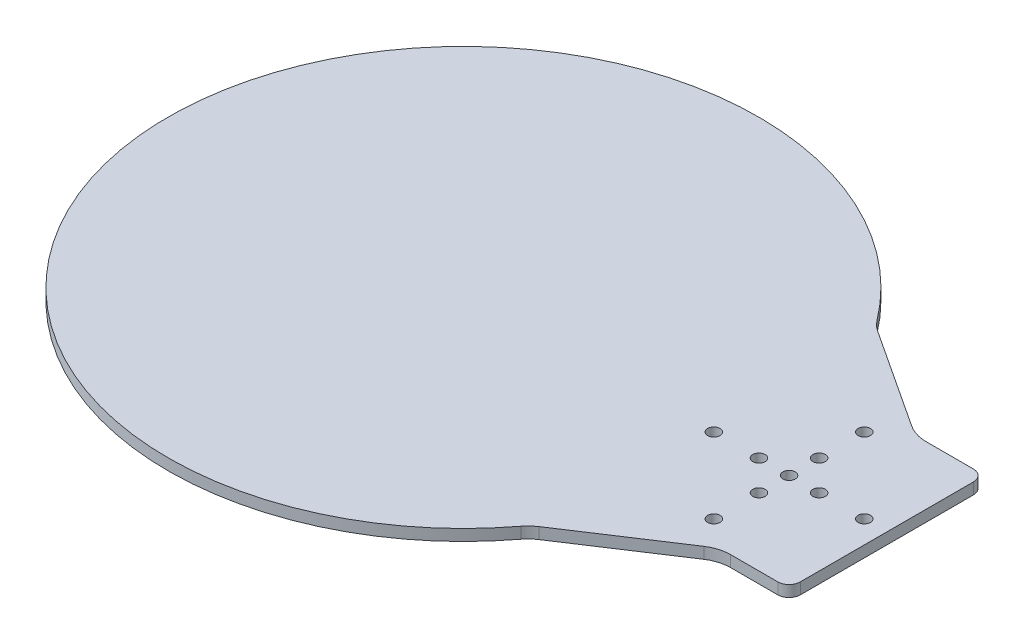
ISO-10303-21;
HEADER;
FILE_DESCRIPTION(('STEP AP214'),'2;1');
FILE_NAME('part.step','',(''),(''),'','','');
FILE_SCHEMA(('AUTOMOTIVE_DESIGN { 1 0 10303 214 1 1 1 1 }'));
ENDSEC;
DATA;
#1=APPLICATION_CONTEXT('core data for automotive mechanical design processes');
#2=APPLICATION_PROTOCOL_DEFINITION('international standard','automotive_design',2000,#1);
#3=PRODUCT_CONTEXT('',#1,'mechanical');
#4=PRODUCT('Part','Part','',(#3));
#5=PRODUCT_RELATED_PRODUCT_CATEGORY('part','',(#4));
#6=PRODUCT_DEFINITION_FORMATION('','',#4);
#7=PRODUCT_DEFINITION_CONTEXT('part definition',#1,'design');
#8=PRODUCT_DEFINITION('design','',#6,#7);
#9=PRODUCT_DEFINITION_SHAPE('','',#8);
#10=(LENGTH_UNIT() NAMED_UNIT(*) SI_UNIT(.MILLI.,.METRE.));
#11=(NAMED_UNIT(*) PLANE_ANGLE_UNIT() SI_UNIT($,.RADIAN.));
#12=(NAMED_UNIT(*) SI_UNIT($,.STERADIAN.) SOLID_ANGLE_UNIT());
#13=UNCERTAINTY_MEASURE_WITH_UNIT(LENGTH_MEASURE(1.E-05),#10,'distance_accuracy_value','');
#14=(GEOMETRIC_REPRESENTATION_CONTEXT(3) GLOBAL_UNCERTAINTY_ASSIGNED_CONTEXT((#13)) GLOBAL_UNIT_ASSIGNED_CONTEXT((#10,
#11,#12)) REPRESENTATION_CONTEXT('',''));
#15=CARTESIAN_POINT('',(0.,0.,0.));
#16=DIRECTION('',(0.,0.,1.));
#17=DIRECTION('',(1.,0.,0.));
#18=AXIS2_PLACEMENT_3D('',#15,#16,#17);
#19=CARTESIAN_POINT('',(0.,3.,0.));
#20=DIRECTION('',(0.,-1.,0.));
#21=DIRECTION('',(0.,0.,-1.));
#22=AXIS2_PLACEMENT_3D('',#19,#20,#21);
#23=CYLINDRICAL_SURFACE('',#22,78.5);
#24=CARTESIAN_POINT('',(0.,0.,0.));
#25=DIRECTION('',(0.,1.,0.));
#26=DIRECTION('',(0.,0.,1.));
#27=AXIS2_PLACEMENT_3D('',#24,#25,#26);
#28=CIRCLE('',#27,78.5);
#29=CARTESIAN_POINT('',(62.6122608933688,0.,-47.349284955749));
#30=VERTEX_POINT('',#29);
#31=CARTESIAN_POINT('',(62.6122608933688,0.,47.349284955749));
#32=VERTEX_POINT('',#31);
#33=EDGE_CURVE('E260',#30,#32,#28,.T.);
#34=ORIENTED_EDGE('',*,*,#33,.T.);
#35=DIRECTION('',(0.,-1.,0.));
#36=VECTOR('',#35,1.);
#37=CARTESIAN_POINT('',(62.6122608933688,3.,47.349284955749));
#38=LINE('',#37,#36);
#39=CARTESIAN_POINT('',(62.6122608933688,3.,47.349284955749));
#40=VERTEX_POINT('',#39);
#41=EDGE_CURVE('E186',#32,#40,#38,.F.);
#42=ORIENTED_EDGE('',*,*,#41,.T.);
#43=CARTESIAN_POINT('',(0.,3.,0.));
#44=DIRECTION('',(0.,1.,0.));
#45=DIRECTION('',(0.,0.,1.));
#46=AXIS2_PLACEMENT_3D('',#43,#44,#45);
#47=CIRCLE('',#46,78.5);
#48=CARTESIAN_POINT('',(62.6122608933688,3.,-47.349284955749));
#49=VERTEX_POINT('',#48);
#50=EDGE_CURVE('E145',#49,#40,#47,.T.);
#51=ORIENTED_EDGE('',*,*,#50,.F.);
#52=DIRECTION('',(0.,-1.,0.));
#53=VECTOR('',#52,1.);
#54=CARTESIAN_POINT('',(62.6122608933688,3.,-47.349284955749));
#55=LINE('',#54,#53);
#56=EDGE_CURVE('E183',#49,#30,#55,.T.);
#57=ORIENTED_EDGE('',*,*,#56,.T.);
#58=EDGE_LOOP('',(#34,#42,#51,#57));
#59=FACE_BOUND('',#58,.T.);
#60=ADVANCED_FACE('F47',(#59),#23,.T.);
#61=CARTESIAN_POINT('',(74.0692243782801,3.,-26.));
#62=DIRECTION('',(0.,0.,1.));
#63=DIRECTION('',(1.,0.,0.));
#64=AXIS2_PLACEMENT_3D('',#61,#62,#63);
#65=PLANE('',#64);
#66=DIRECTION('',(-1.,0.,0.));
#67=VECTOR('',#66,1.);
#68=CARTESIAN_POINT('',(74.0692243782801,3.,-26.));
#69=LINE('',#68,#67);
#70=CARTESIAN_POINT('',(109.579,3.,-26.));
#71=VERTEX_POINT('',#70);
#72=CARTESIAN_POINT('',(97.0588741961012,3.,-26.));
#73=VERTEX_POINT('',#72);
#74=EDGE_CURVE('E169',#71,#73,#69,.T.);
#75=ORIENTED_EDGE('',*,*,#74,.F.);
#76=DIRECTION('',(0.,-1.,0.));
#77=VECTOR('',#76,1.);
#78=CARTESIAN_POINT('',(109.579,3.,-26.));
#79=LINE('',#78,#77);
#80=CARTESIAN_POINT('',(109.579,0.,-26.));
#81=VERTEX_POINT('',#80);
#82=EDGE_CURVE('E220',#71,#81,#79,.T.);
#83=ORIENTED_EDGE('',*,*,#82,.T.);
#84=DIRECTION('',(-1.,0.,0.));
#85=VECTOR('',#84,1.);
#86=CARTESIAN_POINT('',(74.0692243782801,0.,-26.));
#87=LINE('',#86,#85);
#88=CARTESIAN_POINT('',(97.0588741961012,0.,-26.));
#89=VERTEX_POINT('',#88);
#90=EDGE_CURVE('E178',#81,#89,#87,.T.);
#91=ORIENTED_EDGE('',*,*,#90,.T.);
#92=DIRECTION('',(0.,1.,0.));
#93=VECTOR('',#92,1.);
#94=CARTESIAN_POINT('',(97.0588741961012,3.,-26.));
#95=LINE('',#94,#93);
#96=EDGE_CURVE('E196',#89,#73,#95,.T.);
#97=ORIENTED_EDGE('',*,*,#96,.T.);
#98=EDGE_LOOP('',(#75,#83,#91,#97));
#99=FACE_BOUND('',#98,.T.);
#100=ADVANCED_FACE('F245',(#99),#65,.F.);
#101=CARTESIAN_POINT('',(0.,3.,0.));
#102=DIRECTION('',(0.,1.,0.));
#103=DIRECTION('',(0.,0.,1.));
#104=AXIS2_PLACEMENT_3D('',#101,#102,#103);
#105=PLANE('',#104);
#106=DIRECTION('',(0.,0.,-1.));
#107=VECTOR('',#106,1.);
#108=CARTESIAN_POINT('',(112.579,3.,26.));
#109=LINE('',#108,#107);
#110=CARTESIAN_POINT('',(112.579,3.,23.));
#111=VERTEX_POINT('',#110);
#112=CARTESIAN_POINT('',(112.579,3.,-23.));
#113=VERTEX_POINT('',#112);
#114=EDGE_CURVE('E175',#111,#113,#109,.T.);
#115=ORIENTED_EDGE('',*,*,#114,.T.);
#116=CARTESIAN_POINT('',(109.579,3.,-23.));
#117=DIRECTION('',(0.,1.,0.));
#118=DIRECTION('',(0.,0.,1.));
#119=AXIS2_PLACEMENT_3D('',#116,#117,#118);
#120=CIRCLE('',#119,3.);
#121=EDGE_CURVE('E56',#113,#71,#120,.T.);
#122=ORIENTED_EDGE('',*,*,#121,.T.);
#123=ORIENTED_EDGE('',*,*,#74,.T.);
#124=CARTESIAN_POINT('',(97.0588741961012,3.,-36.));
#125=DIRECTION('',(0.,1.,0.));
#126=DIRECTION('',(0.,0.,1.));
#127=AXIS2_PLACEMENT_3D('',#124,#125,#126);
#128=CIRCLE('',#127,10.);
#129=CARTESIAN_POINT('',(91.5701564809816,3.,-27.6409343917079));
#130=VERTEX_POINT('',#129);
#131=EDGE_CURVE('E213',#73,#130,#128,.F.);
#132=ORIENTED_EDGE('',*,*,#131,.T.);
#133=DIRECTION('',(0.835906560829211,0.,0.548871771511963));
#134=VECTOR('',#133,1.);
#135=CARTESIAN_POINT('',(40.268258764811,3.,-61.3267131628034));
#136=LINE('',#135,#134);
#137=CARTESIAN_POINT('',(65.0996273684873,3.,-45.0219753927752));
#138=VERTEX_POINT('',#137);
#139=EDGE_CURVE('E347',#138,#130,#136,.T.);
#140=ORIENTED_EDGE('',*,*,#139,.F.);
#141=CARTESIAN_POINT('',(70.5883450836069,3.,-53.3810410010673));
#142=DIRECTION('',(0.,1.,0.));
#143=DIRECTION('',(0.,0.,1.));
#144=AXIS2_PLACEMENT_3D('',#141,#142,#143);
#145=CIRCLE('',#144,10.);
#146=EDGE_CURVE('E207',#138,#49,#145,.F.);
#147=ORIENTED_EDGE('',*,*,#146,.T.);
#148=ORIENTED_EDGE('',*,*,#50,.T.);
#149=CARTESIAN_POINT('',(70.5883450836069,3.,53.3810410010673));
#150=DIRECTION('',(0.,1.,0.));
#151=DIRECTION('',(0.,0.,1.));
#152=AXIS2_PLACEMENT_3D('',#149,#150,#151);
#153=CIRCLE('',#152,10.);
#154=CARTESIAN_POINT('',(65.0996273684873,3.,45.0219753927752));
#155=VERTEX_POINT('',#154);
#156=EDGE_CURVE('E139',#40,#155,#153,.F.);
#157=ORIENTED_EDGE('',*,*,#156,.T.);
#158=DIRECTION('',(0.835906560829211,0.,-0.548871771511963));
#159=VECTOR('',#158,1.);
#160=CARTESIAN_POINT('',(40.268258764811,3.,61.3267131628034));
#161=LINE('',#160,#159);
#162=CARTESIAN_POINT('',(91.5701564809816,3.,27.6409343917079));
#163=VERTEX_POINT('',#162);
#164=EDGE_CURVE('E143',#155,#163,#161,.T.);
#165=ORIENTED_EDGE('',*,*,#164,.T.);
#166=CARTESIAN_POINT('',(97.0588741961012,3.,36.));
#167=DIRECTION('',(0.,1.,0.));
#168=DIRECTION('',(0.,0.,1.));
#169=AXIS2_PLACEMENT_3D('',#166,#167,#168);
#170=CIRCLE('',#169,10.);
#171=CARTESIAN_POINT('',(97.0588741961012,3.,26.));
#172=VERTEX_POINT('',#171);
#173=EDGE_CURVE('E200',#163,#172,#170,.F.);
#174=ORIENTED_EDGE('',*,*,#173,.T.);
#175=DIRECTION('',(1.,0.,0.));
#176=VECTOR('',#175,1.);
#177=CARTESIAN_POINT('',(74.0692243782801,3.,26.));
#178=LINE('',#177,#176);
#179=CARTESIAN_POINT('',(109.579,3.,26.));
#180=VERTEX_POINT('',#179);
#181=EDGE_CURVE('E269',#172,#180,#178,.T.);
#182=ORIENTED_EDGE('',*,*,#181,.T.);
#183=CARTESIAN_POINT('',(109.579,3.,23.));
#184=DIRECTION('',(0.,1.,0.));
#185=DIRECTION('',(0.,0.,1.));
#186=AXIS2_PLACEMENT_3D('',#183,#184,#185);
#187=CIRCLE('',#186,3.);
#188=EDGE_CURVE('E236',#180,#111,#187,.T.);
#189=ORIENTED_EDGE('',*,*,#188,.T.);
#190=EDGE_LOOP('',(#115,#122,#123,#132,#140,#147,#148,#157,#165,#174,#182,#189));
#191=FACE_BOUND('',#190,.T.);
#192=CARTESIAN_POINT('',(86.579,3.,-8.00000000000001));
#193=DIRECTION('',(0.,1.,0.));
#194=DIRECTION('',(0.,0.,1.));
#195=AXIS2_PLACEMENT_3D('',#192,#193,#194);
#196=CIRCLE('',#195,1.65);
#197=CARTESIAN_POINT('',(86.579,3.,-6.35));
#198=VERTEX_POINT('',#197);
#199=EDGE_CURVE('E326',#198,#198,#196,.T.);
#200=ORIENTED_EDGE('',*,*,#199,.F.);
#201=EDGE_LOOP('',(#200));
#202=FACE_BOUND('',#201,.T.);
#203=CARTESIAN_POINT('',(78.579,3.,0.));
#204=DIRECTION('',(0.,1.,0.));
#205=DIRECTION('',(0.,0.,1.));
#206=AXIS2_PLACEMENT_3D('',#203,#204,#205);
#207=CIRCLE('',#206,1.65);
#208=CARTESIAN_POINT('',(78.579,3.,1.65));
#209=VERTEX_POINT('',#208);
#210=EDGE_CURVE('E310',#209,#209,#207,.T.);
#211=ORIENTED_EDGE('',*,*,#210,.F.);
#212=EDGE_LOOP('',(#211));
#213=FACE_BOUND('',#212,.T.);
#214=CARTESIAN_POINT('',(86.579,3.,8.00000000000001));
#215=DIRECTION('',(0.,1.,0.));
#216=DIRECTION('',(0.,0.,1.));
#217=AXIS2_PLACEMENT_3D('',#214,#215,#216);
#218=CIRCLE('',#217,1.65);
#219=CARTESIAN_POINT('',(86.579,3.,9.65000000000001));
#220=VERTEX_POINT('',#219);
#221=EDGE_CURVE('E294',#220,#220,#218,.T.);
#222=ORIENTED_EDGE('',*,*,#221,.F.);
#223=EDGE_LOOP('',(#222));
#224=FACE_BOUND('',#223,.T.);
#225=CARTESIAN_POINT('',(94.579,3.,0.));
#226=DIRECTION('',(0.,1.,0.));
#227=DIRECTION('',(0.,0.,1.));
#228=AXIS2_PLACEMENT_3D('',#225,#226,#227);
#229=CIRCLE('',#228,1.65);
#230=CARTESIAN_POINT('',(94.579,3.,1.65));
#231=VERTEX_POINT('',#230);
#232=EDGE_CURVE('E278',#231,#231,#229,.T.);
#233=ORIENTED_EDGE('',*,*,#232,.F.);
#234=EDGE_LOOP('',(#233));
#235=FACE_BOUND('',#234,.T.);
#236=CARTESIAN_POINT('',(86.579,3.,0.));
#237=DIRECTION('',(0.,1.,0.));
#238=DIRECTION('',(0.,0.,1.));
#239=AXIS2_PLACEMENT_3D('',#236,#237,#238);
#240=CIRCLE('',#239,1.65);
#241=CARTESIAN_POINT('',(86.579,3.,1.65));
#242=VERTEX_POINT('',#241);
#243=EDGE_CURVE('E265',#242,#242,#240,.T.);
#244=ORIENTED_EDGE('',*,*,#243,.F.);
#245=EDGE_LOOP('',(#244));
#246=FACE_BOUND('',#245,.T.);
#247=CARTESIAN_POINT('',(106.579,3.,0.));
#248=DIRECTION('',(0.,1.,0.));
#249=DIRECTION('',(0.,0.,1.));
#250=AXIS2_PLACEMENT_3D('',#247,#248,#249);
#251=CIRCLE('',#250,1.65);
#252=CARTESIAN_POINT('',(106.579,3.,1.65));
#253=VERTEX_POINT('',#252);
#254=EDGE_CURVE('E286',#253,#253,#251,.T.);
#255=ORIENTED_EDGE('',*,*,#254,.F.);
#256=EDGE_LOOP('',(#255));
#257=FACE_BOUND('',#256,.T.);
#258=CARTESIAN_POINT('',(86.579,3.,20.));
#259=DIRECTION('',(0.,1.,0.));
#260=DIRECTION('',(0.,0.,1.));
#261=AXIS2_PLACEMENT_3D('',#258,#259,#260);
#262=CIRCLE('',#261,1.65);
#263=CARTESIAN_POINT('',(86.579,3.,21.65));
#264=VERTEX_POINT('',#263);
#265=EDGE_CURVE('E302',#264,#264,#262,.T.);
#266=ORIENTED_EDGE('',*,*,#265,.F.);
#267=EDGE_LOOP('',(#266));
#268=FACE_BOUND('',#267,.T.);
#269=CARTESIAN_POINT('',(66.579,3.,0.));
#270=DIRECTION('',(0.,1.,0.));
#271=DIRECTION('',(0.,0.,1.));
#272=AXIS2_PLACEMENT_3D('',#269,#270,#271);
#273=CIRCLE('',#272,1.65);
#274=CARTESIAN_POINT('',(66.579,3.,1.65));
#275=VERTEX_POINT('',#274);
#276=EDGE_CURVE('E318',#275,#275,#273,.T.);
#277=ORIENTED_EDGE('',*,*,#276,.F.);
#278=EDGE_LOOP('',(#277));
#279=FACE_BOUND('',#278,.T.);
#280=CARTESIAN_POINT('',(86.579,3.,-20.));
#281=DIRECTION('',(0.,1.,0.));
#282=DIRECTION('',(0.,0.,1.));
#283=AXIS2_PLACEMENT_3D('',#280,#281,#282);
#284=CIRCLE('',#283,1.65);
#285=CARTESIAN_POINT('',(86.579,3.,-18.35));
#286=VERTEX_POINT('',#285);
#287=EDGE_CURVE('E334',#286,#286,#284,.T.);
#288=ORIENTED_EDGE('',*,*,#287,.F.);
#289=EDGE_LOOP('',(#288));
#290=FACE_BOUND('',#289,.T.);
#291=ADVANCED_FACE('F141',(#191,#202,#213,#224,#235,#246,#257,#268,#279,#290),#105,.T.);
#292=CARTESIAN_POINT('',(0.,0.,0.));
#293=DIRECTION('',(0.,1.,0.));
#294=DIRECTION('',(0.,0.,1.));
#295=AXIS2_PLACEMENT_3D('',#292,#293,#294);
#296=PLANE('',#295);
#297=ORIENTED_EDGE('',*,*,#90,.F.);
#298=CARTESIAN_POINT('',(109.579,0.,-23.));
#299=DIRECTION('',(0.,1.,0.));
#300=DIRECTION('',(0.,0.,1.));
#301=AXIS2_PLACEMENT_3D('',#298,#299,#300);
#302=CIRCLE('',#301,3.);
#303=CARTESIAN_POINT('',(112.579,0.,-23.));
#304=VERTEX_POINT('',#303);
#305=EDGE_CURVE('E227',#81,#304,#302,.F.);
#306=ORIENTED_EDGE('',*,*,#305,.T.);
#307=DIRECTION('',(0.,0.,-1.));
#308=VECTOR('',#307,1.);
#309=CARTESIAN_POINT('',(112.579,0.,26.));
#310=LINE('',#309,#308);
#311=CARTESIAN_POINT('',(112.579,0.,23.));
#312=VERTEX_POINT('',#311);
#313=EDGE_CURVE('E253',#312,#304,#310,.T.);
#314=ORIENTED_EDGE('',*,*,#313,.F.);
#315=CARTESIAN_POINT('',(109.579,0.,23.));
#316=DIRECTION('',(0.,1.,0.));
#317=DIRECTION('',(0.,0.,1.));
#318=AXIS2_PLACEMENT_3D('',#315,#316,#317);
#319=CIRCLE('',#318,3.);
#320=CARTESIAN_POINT('',(109.579,0.,26.));
#321=VERTEX_POINT('',#320);
#322=EDGE_CURVE('E224',#312,#321,#319,.F.);
#323=ORIENTED_EDGE('',*,*,#322,.T.);
#324=DIRECTION('',(1.,0.,0.));
#325=VECTOR('',#324,1.);
#326=CARTESIAN_POINT('',(74.0692243782801,0.,26.));
#327=LINE('',#326,#325);
#328=CARTESIAN_POINT('',(97.0588741961012,0.,26.));
#329=VERTEX_POINT('',#328);
#330=EDGE_CURVE('E257',#329,#321,#327,.T.);
#331=ORIENTED_EDGE('',*,*,#330,.F.);
#332=CARTESIAN_POINT('',(97.0588741961012,0.,36.));
#333=DIRECTION('',(0.,1.,0.));
#334=DIRECTION('',(0.,0.,1.));
#335=AXIS2_PLACEMENT_3D('',#332,#333,#334);
#336=CIRCLE('',#335,10.);
#337=CARTESIAN_POINT('',(91.5701564809816,0.,27.6409343917079));
#338=VERTEX_POINT('',#337);
#339=EDGE_CURVE('E152',#329,#338,#336,.T.);
#340=ORIENTED_EDGE('',*,*,#339,.T.);
#341=DIRECTION('',(0.835906560829211,0.,-0.548871771511963));
#342=VECTOR('',#341,1.);
#343=CARTESIAN_POINT('',(40.268258764811,0.,61.3267131628034));
#344=LINE('',#343,#342);
#345=CARTESIAN_POINT('',(65.0996273684873,0.,45.0219753927752));
#346=VERTEX_POINT('',#345);
#347=EDGE_CURVE('E163',#346,#338,#344,.T.);
#348=ORIENTED_EDGE('',*,*,#347,.F.);
#349=CARTESIAN_POINT('',(70.5883450836069,0.,53.3810410010673));
#350=DIRECTION('',(0.,1.,0.));
#351=DIRECTION('',(0.,0.,1.));
#352=AXIS2_PLACEMENT_3D('',#349,#350,#351);
#353=CIRCLE('',#352,10.);
#354=EDGE_CURVE('E151',#346,#32,#353,.T.);
#355=ORIENTED_EDGE('',*,*,#354,.T.);
#356=ORIENTED_EDGE('',*,*,#33,.F.);
#357=CARTESIAN_POINT('',(70.5883450836069,0.,-53.3810410010673));
#358=DIRECTION('',(0.,1.,0.));
#359=DIRECTION('',(0.,0.,1.));
#360=AXIS2_PLACEMENT_3D('',#357,#358,#359);
#361=CIRCLE('',#360,10.);
#362=CARTESIAN_POINT('',(65.0996273684873,0.,-45.0219753927752));
#363=VERTEX_POINT('',#362);
#364=EDGE_CURVE('E210',#30,#363,#361,.T.);
#365=ORIENTED_EDGE('',*,*,#364,.T.);
#366=DIRECTION('',(0.835906560829211,0.,0.548871771511963));
#367=VECTOR('',#366,1.);
#368=CARTESIAN_POINT('',(40.268258764811,0.,-61.3267131628034));
#369=LINE('',#368,#367);
#370=CARTESIAN_POINT('',(91.5701564809816,0.,-27.6409343917079));
#371=VERTEX_POINT('',#370);
#372=EDGE_CURVE('E164',#363,#371,#369,.T.);
#373=ORIENTED_EDGE('',*,*,#372,.T.);
#374=CARTESIAN_POINT('',(97.0588741961012,0.,-36.));
#375=DIRECTION('',(0.,1.,0.));
#376=DIRECTION('',(0.,0.,1.));
#377=AXIS2_PLACEMENT_3D('',#374,#375,#376);
#378=CIRCLE('',#377,10.);
#379=EDGE_CURVE('E216',#371,#89,#378,.T.);
#380=ORIENTED_EDGE('',*,*,#379,.T.);
#381=EDGE_LOOP('',(#297,#306,#314,#323,#331,#340,#348,#355,#356,#365,#373,#380));
#382=FACE_BOUND('',#381,.T.);
#383=CARTESIAN_POINT('',(86.579,0.,0.));
#384=DIRECTION('',(0.,1.,0.));
#385=DIRECTION('',(0.,0.,1.));
#386=AXIS2_PLACEMENT_3D('',#383,#384,#385);
#387=CIRCLE('',#386,1.65);
#388=CARTESIAN_POINT('',(86.579,0.,1.65));
#389=VERTEX_POINT('',#388);
#390=EDGE_CURVE('E274',#389,#389,#387,.T.);
#391=ORIENTED_EDGE('',*,*,#390,.T.);
#392=EDGE_LOOP('',(#391));
#393=FACE_BOUND('',#392,.T.);
#394=CARTESIAN_POINT('',(94.579,0.,0.));
#395=DIRECTION('',(0.,1.,0.));
#396=DIRECTION('',(0.,0.,1.));
#397=AXIS2_PLACEMENT_3D('',#394,#395,#396);
#398=CIRCLE('',#397,1.65);
#399=CARTESIAN_POINT('',(94.579,0.,1.65));
#400=VERTEX_POINT('',#399);
#401=EDGE_CURVE('E282',#400,#400,#398,.T.);
#402=ORIENTED_EDGE('',*,*,#401,.T.);
#403=EDGE_LOOP('',(#402));
#404=FACE_BOUND('',#403,.T.);
#405=CARTESIAN_POINT('',(106.579,0.,0.));
#406=DIRECTION('',(0.,1.,0.));
#407=DIRECTION('',(0.,0.,1.));
#408=AXIS2_PLACEMENT_3D('',#405,#406,#407);
#409=CIRCLE('',#408,1.65);
#410=CARTESIAN_POINT('',(106.579,0.,1.65));
#411=VERTEX_POINT('',#410);
#412=EDGE_CURVE('E290',#411,#411,#409,.T.);
#413=ORIENTED_EDGE('',*,*,#412,.T.);
#414=EDGE_LOOP('',(#413));
#415=FACE_BOUND('',#414,.T.);
#416=CARTESIAN_POINT('',(86.579,0.,8.00000000000001));
#417=DIRECTION('',(0.,1.,0.));
#418=DIRECTION('',(0.,0.,1.));
#419=AXIS2_PLACEMENT_3D('',#416,#417,#418);
#420=CIRCLE('',#419,1.65);
#421=CARTESIAN_POINT('',(86.579,0.,9.65000000000001));
#422=VERTEX_POINT('',#421);
#423=EDGE_CURVE('E298',#422,#422,#420,.T.);
#424=ORIENTED_EDGE('',*,*,#423,.T.);
#425=EDGE_LOOP('',(#424));
#426=FACE_BOUND('',#425,.T.);
#427=CARTESIAN_POINT('',(86.579,0.,20.));
#428=DIRECTION('',(0.,1.,0.));
#429=DIRECTION('',(0.,0.,1.));
#430=AXIS2_PLACEMENT_3D('',#427,#428,#429);
#431=CIRCLE('',#430,1.65);
#432=CARTESIAN_POINT('',(86.579,0.,21.65));
#433=VERTEX_POINT('',#432);
#434=EDGE_CURVE('E306',#433,#433,#431,.T.);
#435=ORIENTED_EDGE('',*,*,#434,.T.);
#436=EDGE_LOOP('',(#435));
#437=FACE_BOUND('',#436,.T.);
#438=CARTESIAN_POINT('',(78.579,0.,0.));
#439=DIRECTION('',(0.,1.,0.));
#440=DIRECTION('',(0.,0.,1.));
#441=AXIS2_PLACEMENT_3D('',#438,#439,#440);
#442=CIRCLE('',#441,1.65);
#443=CARTESIAN_POINT('',(78.579,0.,1.65));
#444=VERTEX_POINT('',#443);
#445=EDGE_CURVE('E314',#444,#444,#442,.T.);
#446=ORIENTED_EDGE('',*,*,#445,.T.);
#447=EDGE_LOOP('',(#446));
#448=FACE_BOUND('',#447,.T.);
#449=CARTESIAN_POINT('',(66.579,0.,0.));
#450=DIRECTION('',(0.,1.,0.));
#451=DIRECTION('',(0.,0.,1.));
#452=AXIS2_PLACEMENT_3D('',#449,#450,#451);
#453=CIRCLE('',#452,1.65);
#454=CARTESIAN_POINT('',(66.579,0.,1.65));
#455=VERTEX_POINT('',#454);
#456=EDGE_CURVE('E322',#455,#455,#453,.T.);
#457=ORIENTED_EDGE('',*,*,#456,.T.);
#458=EDGE_LOOP('',(#457));
#459=FACE_BOUND('',#458,.T.);
#460=CARTESIAN_POINT('',(86.579,0.,-8.00000000000001));
#461=DIRECTION('',(0.,1.,0.));
#462=DIRECTION('',(0.,0.,1.));
#463=AXIS2_PLACEMENT_3D('',#460,#461,#462);
#464=CIRCLE('',#463,1.65);
#465=CARTESIAN_POINT('',(86.579,0.,-6.35));
#466=VERTEX_POINT('',#465);
#467=EDGE_CURVE('E330',#466,#466,#464,.T.);
#468=ORIENTED_EDGE('',*,*,#467,.T.);
#469=EDGE_LOOP('',(#468));
#470=FACE_BOUND('',#469,.T.);
#471=CARTESIAN_POINT('',(86.579,0.,-20.));
#472=DIRECTION('',(0.,1.,0.));
#473=DIRECTION('',(0.,0.,1.));
#474=AXIS2_PLACEMENT_3D('',#471,#472,#473);
#475=CIRCLE('',#474,1.65);
#476=CARTESIAN_POINT('',(86.579,0.,-18.35));
#477=VERTEX_POINT('',#476);
#478=EDGE_CURVE('E338',#477,#477,#475,.T.);
#479=ORIENTED_EDGE('',*,*,#478,.T.);
#480=EDGE_LOOP('',(#479));
#481=FACE_BOUND('',#480,.T.);
#482=ADVANCED_FACE('F251',(#382,#393,#404,#415,#426,#437,#448,#459,#470,#481),#296,.F.);
#483=CARTESIAN_POINT('',(74.0692243782801,3.,26.));
#484=DIRECTION('',(0.,0.,-1.));
#485=DIRECTION('',(-1.,0.,0.));
#486=AXIS2_PLACEMENT_3D('',#483,#484,#485);
#487=PLANE('',#486);
#488=ORIENTED_EDGE('',*,*,#330,.T.);
#489=DIRECTION('',(0.,-1.,0.));
#490=VECTOR('',#489,1.);
#491=CARTESIAN_POINT('',(109.579,3.,26.));
#492=LINE('',#491,#490);
#493=EDGE_CURVE('E11',#321,#180,#492,.F.);
#494=ORIENTED_EDGE('',*,*,#493,.T.);
#495=ORIENTED_EDGE('',*,*,#181,.F.);
#496=DIRECTION('',(0.,1.,0.));
#497=VECTOR('',#496,1.);
#498=CARTESIAN_POINT('',(97.0588741961012,3.,26.));
#499=LINE('',#498,#497);
#500=EDGE_CURVE('E173',#172,#329,#499,.F.);
#501=ORIENTED_EDGE('',*,*,#500,.T.);
#502=EDGE_LOOP('',(#488,#494,#495,#501));
#503=FACE_BOUND('',#502,.T.);
#504=ADVANCED_FACE('F374',(#503),#487,.F.);
#505=CARTESIAN_POINT('',(112.579,3.,26.));
#506=DIRECTION('',(-1.,0.,0.));
#507=DIRECTION('',(0.,0.,1.));
#508=AXIS2_PLACEMENT_3D('',#505,#506,#507);
#509=PLANE('',#508);
#510=ORIENTED_EDGE('',*,*,#313,.T.);
#511=DIRECTION('',(0.,-1.,0.));
#512=VECTOR('',#511,1.);
#513=CARTESIAN_POINT('',(112.579,3.,-23.));
#514=LINE('',#513,#512);
#515=EDGE_CURVE('E69',#304,#113,#514,.F.);
#516=ORIENTED_EDGE('',*,*,#515,.T.);
#517=ORIENTED_EDGE('',*,*,#114,.F.);
#518=DIRECTION('',(0.,-1.,0.));
#519=VECTOR('',#518,1.);
#520=CARTESIAN_POINT('',(112.579,3.,23.));
#521=LINE('',#520,#519);
#522=EDGE_CURVE('E230',#111,#312,#521,.T.);
#523=ORIENTED_EDGE('',*,*,#522,.T.);
#524=EDGE_LOOP('',(#510,#516,#517,#523));
#525=FACE_BOUND('',#524,.T.);
#526=ADVANCED_FACE('F254',(#525),#509,.F.);
#527=CARTESIAN_POINT('',(86.579,3.,0.));
#528=DIRECTION('',(0.,-1.,0.));
#529=DIRECTION('',(0.,0.,-1.));
#530=AXIS2_PLACEMENT_3D('',#527,#528,#529);
#531=CYLINDRICAL_SURFACE('',#530,1.65);
#532=ORIENTED_EDGE('',*,*,#243,.T.);
#533=EDGE_LOOP('',(#532));
#534=FACE_BOUND('',#533,.T.);
#535=ORIENTED_EDGE('',*,*,#390,.F.);
#536=EDGE_LOOP('',(#535));
#537=FACE_BOUND('',#536,.T.);
#538=ADVANCED_FACE('F436',(#534,#537),#531,.F.);
#539=CARTESIAN_POINT('',(94.579,3.,0.));
#540=DIRECTION('',(0.,-1.,0.));
#541=DIRECTION('',(0.,0.,-1.));
#542=AXIS2_PLACEMENT_3D('',#539,#540,#541);
#543=CYLINDRICAL_SURFACE('',#542,1.65);
#544=ORIENTED_EDGE('',*,*,#232,.T.);
#545=EDGE_LOOP('',(#544));
#546=FACE_BOUND('',#545,.T.);
#547=ORIENTED_EDGE('',*,*,#401,.F.);
#548=EDGE_LOOP('',(#547));
#549=FACE_BOUND('',#548,.T.);
#550=ADVANCED_FACE('F504',(#546,#549),#543,.F.);
#551=CARTESIAN_POINT('',(106.579,3.,0.));
#552=DIRECTION('',(0.,-1.,0.));
#553=DIRECTION('',(0.,0.,-1.));
#554=AXIS2_PLACEMENT_3D('',#551,#552,#553);
#555=CYLINDRICAL_SURFACE('',#554,1.65);
#556=ORIENTED_EDGE('',*,*,#254,.T.);
#557=EDGE_LOOP('',(#556));
#558=FACE_BOUND('',#557,.T.);
#559=ORIENTED_EDGE('',*,*,#412,.F.);
#560=EDGE_LOOP('',(#559));
#561=FACE_BOUND('',#560,.T.);
#562=ADVANCED_FACE('F513',(#558,#561),#555,.F.);
#563=CARTESIAN_POINT('',(86.579,3.,8.00000000000001));
#564=DIRECTION('',(0.,-1.,0.));
#565=DIRECTION('',(0.,0.,-1.));
#566=AXIS2_PLACEMENT_3D('',#563,#564,#565);
#567=CYLINDRICAL_SURFACE('',#566,1.65);
#568=ORIENTED_EDGE('',*,*,#221,.T.);
#569=EDGE_LOOP('',(#568));
#570=FACE_BOUND('',#569,.T.);
#571=ORIENTED_EDGE('',*,*,#423,.F.);
#572=EDGE_LOOP('',(#571));
#573=FACE_BOUND('',#572,.T.);
#574=ADVANCED_FACE('F522',(#570,#573),#567,.F.);
#575=CARTESIAN_POINT('',(86.579,3.,20.));
#576=DIRECTION('',(0.,-1.,0.));
#577=DIRECTION('',(0.,0.,-1.));
#578=AXIS2_PLACEMENT_3D('',#575,#576,#577);
#579=CYLINDRICAL_SURFACE('',#578,1.65);
#580=ORIENTED_EDGE('',*,*,#265,.T.);
#581=EDGE_LOOP('',(#580));
#582=FACE_BOUND('',#581,.T.);
#583=ORIENTED_EDGE('',*,*,#434,.F.);
#584=EDGE_LOOP('',(#583));
#585=FACE_BOUND('',#584,.T.);
#586=ADVANCED_FACE('F531',(#582,#585),#579,.F.);
#587=CARTESIAN_POINT('',(78.579,3.,0.));
#588=DIRECTION('',(0.,-1.,0.));
#589=DIRECTION('',(0.,0.,-1.));
#590=AXIS2_PLACEMENT_3D('',#587,#588,#589);
#591=CYLINDRICAL_SURFACE('',#590,1.65);
#592=ORIENTED_EDGE('',*,*,#210,.T.);
#593=EDGE_LOOP('',(#592));
#594=FACE_BOUND('',#593,.T.);
#595=ORIENTED_EDGE('',*,*,#445,.F.);
#596=EDGE_LOOP('',(#595));
#597=FACE_BOUND('',#596,.T.);
#598=ADVANCED_FACE('F540',(#594,#597),#591,.F.);
#599=CARTESIAN_POINT('',(66.579,3.,0.));
#600=DIRECTION('',(0.,-1.,0.));
#601=DIRECTION('',(0.,0.,-1.));
#602=AXIS2_PLACEMENT_3D('',#599,#600,#601);
#603=CYLINDRICAL_SURFACE('',#602,1.65);
#604=ORIENTED_EDGE('',*,*,#276,.T.);
#605=EDGE_LOOP('',(#604));
#606=FACE_BOUND('',#605,.T.);
#607=ORIENTED_EDGE('',*,*,#456,.F.);
#608=EDGE_LOOP('',(#607));
#609=FACE_BOUND('',#608,.T.);
#610=ADVANCED_FACE('F549',(#606,#609),#603,.F.);
#611=CARTESIAN_POINT('',(86.579,3.,-8.00000000000001));
#612=DIRECTION('',(0.,-1.,0.));
#613=DIRECTION('',(0.,0.,-1.));
#614=AXIS2_PLACEMENT_3D('',#611,#612,#613);
#615=CYLINDRICAL_SURFACE('',#614,1.65);
#616=ORIENTED_EDGE('',*,*,#199,.T.);
#617=EDGE_LOOP('',(#616));
#618=FACE_BOUND('',#617,.T.);
#619=ORIENTED_EDGE('',*,*,#467,.F.);
#620=EDGE_LOOP('',(#619));
#621=FACE_BOUND('',#620,.T.);
#622=ADVANCED_FACE('F558',(#618,#621),#615,.F.);
#623=CARTESIAN_POINT('',(86.579,3.,-20.));
#624=DIRECTION('',(0.,-1.,0.));
#625=DIRECTION('',(0.,0.,-1.));
#626=AXIS2_PLACEMENT_3D('',#623,#624,#625);
#627=CYLINDRICAL_SURFACE('',#626,1.65);
#628=ORIENTED_EDGE('',*,*,#287,.T.);
#629=EDGE_LOOP('',(#628));
#630=FACE_BOUND('',#629,.T.);
#631=ORIENTED_EDGE('',*,*,#478,.F.);
#632=EDGE_LOOP('',(#631));
#633=FACE_BOUND('',#632,.T.);
#634=ADVANCED_FACE('F474',(#630,#633),#627,.F.);
#635=CARTESIAN_POINT('',(40.268258764811,0.,61.3267131628034));
#636=DIRECTION('',(0.548871771511963,0.,0.835906560829211));
#637=DIRECTION('',(0.835906560829211,0.,-0.548871771511963));
#638=AXIS2_PLACEMENT_3D('',#635,#636,#637);
#639=PLANE('',#638);
#640=ORIENTED_EDGE('',*,*,#347,.T.);
#641=DIRECTION('',(0.,1.,0.));
#642=VECTOR('',#641,1.);
#643=CARTESIAN_POINT('',(91.5701564809816,0.,27.6409343917079));
#644=LINE('',#643,#642);
#645=EDGE_CURVE('E161',#338,#163,#644,.T.);
#646=ORIENTED_EDGE('',*,*,#645,.T.);
#647=ORIENTED_EDGE('',*,*,#164,.F.);
#648=DIRECTION('',(0.,-1.,0.));
#649=VECTOR('',#648,1.);
#650=CARTESIAN_POINT('',(65.0996273684873,0.,45.0219753927752));
#651=LINE('',#650,#649);
#652=EDGE_CURVE('E158',#155,#346,#651,.T.);
#653=ORIENTED_EDGE('',*,*,#652,.T.);
#654=EDGE_LOOP('',(#640,#646,#647,#653));
#655=FACE_BOUND('',#654,.T.);
#656=ADVANCED_FACE('F157',(#655),#639,.T.);
#657=CARTESIAN_POINT('',(40.268258764811,0.,-61.3267131628034));
#658=DIRECTION('',(-0.548871771511963,0.,0.835906560829211));
#659=DIRECTION('',(0.835906560829211,0.,0.548871771511963));
#660=AXIS2_PLACEMENT_3D('',#657,#658,#659);
#661=PLANE('',#660);
#662=ORIENTED_EDGE('',*,*,#372,.F.);
#663=DIRECTION('',(0.,1.,0.));
#664=VECTOR('',#663,1.);
#665=CARTESIAN_POINT('',(65.0996273684873,3.,-45.0219753927752));
#666=LINE('',#665,#664);
#667=EDGE_CURVE('E192',#363,#138,#666,.T.);
#668=ORIENTED_EDGE('',*,*,#667,.T.);
#669=ORIENTED_EDGE('',*,*,#139,.T.);
#670=DIRECTION('',(0.,1.,0.));
#671=VECTOR('',#670,1.);
#672=CARTESIAN_POINT('',(91.5701564809816,0.,-27.6409343917079));
#673=LINE('',#672,#671);
#674=EDGE_CURVE('E189',#130,#371,#673,.F.);
#675=ORIENTED_EDGE('',*,*,#674,.T.);
#676=EDGE_LOOP('',(#662,#668,#669,#675));
#677=FACE_BOUND('',#676,.T.);
#678=ADVANCED_FACE('F363',(#677),#661,.F.);
#679=CARTESIAN_POINT('',(97.0588741961012,0.,36.));
#680=DIRECTION('',(0.,1.,0.));
#681=DIRECTION('',(0.,0.,1.));
#682=AXIS2_PLACEMENT_3D('',#679,#680,#681);
#683=CYLINDRICAL_SURFACE('',#682,10.);
#684=ORIENTED_EDGE('',*,*,#339,.F.);
#685=ORIENTED_EDGE('',*,*,#500,.F.);
#686=ORIENTED_EDGE('',*,*,#173,.F.);
#687=ORIENTED_EDGE('',*,*,#645,.F.);
#688=EDGE_LOOP('',(#684,#685,#686,#687));
#689=FACE_BOUND('',#688,.T.);
#690=ADVANCED_FACE('F371',(#689),#683,.F.);
#691=CARTESIAN_POINT('',(70.5883450836069,3.,53.3810410010673));
#692=DIRECTION('',(0.,-1.,0.));
#693=DIRECTION('',(0.,0.,-1.));
#694=AXIS2_PLACEMENT_3D('',#691,#692,#693);
#695=CYLINDRICAL_SURFACE('',#694,10.);
#696=ORIENTED_EDGE('',*,*,#354,.F.);
#697=ORIENTED_EDGE('',*,*,#652,.F.);
#698=ORIENTED_EDGE('',*,*,#156,.F.);
#699=ORIENTED_EDGE('',*,*,#41,.F.);
#700=EDGE_LOOP('',(#696,#697,#698,#699));
#701=FACE_BOUND('',#700,.T.);
#702=ADVANCED_FACE('F167',(#701),#695,.F.);
#703=CARTESIAN_POINT('',(70.5883450836069,3.,-53.3810410010673));
#704=DIRECTION('',(0.,-1.,0.));
#705=DIRECTION('',(0.,0.,-1.));
#706=AXIS2_PLACEMENT_3D('',#703,#704,#705);
#707=CYLINDRICAL_SURFACE('',#706,10.);
#708=ORIENTED_EDGE('',*,*,#364,.F.);
#709=ORIENTED_EDGE('',*,*,#56,.F.);
#710=ORIENTED_EDGE('',*,*,#146,.F.);
#711=ORIENTED_EDGE('',*,*,#667,.F.);
#712=EDGE_LOOP('',(#708,#709,#710,#711));
#713=FACE_BOUND('',#712,.T.);
#714=ADVANCED_FACE('F365',(#713),#707,.F.);
#715=CARTESIAN_POINT('',(97.0588741961012,3.,-36.));
#716=DIRECTION('',(0.,-1.,0.));
#717=DIRECTION('',(0.,0.,-1.));
#718=AXIS2_PLACEMENT_3D('',#715,#716,#717);
#719=CYLINDRICAL_SURFACE('',#718,10.);
#720=ORIENTED_EDGE('',*,*,#379,.F.);
#721=ORIENTED_EDGE('',*,*,#674,.F.);
#722=ORIENTED_EDGE('',*,*,#131,.F.);
#723=ORIENTED_EDGE('',*,*,#96,.F.);
#724=EDGE_LOOP('',(#720,#721,#722,#723));
#725=FACE_BOUND('',#724,.T.);
#726=ADVANCED_FACE('F361',(#725),#719,.F.);
#727=CARTESIAN_POINT('',(109.579,3.,-23.));
#728=DIRECTION('',(0.,-1.,0.));
#729=DIRECTION('',(0.,0.,-1.));
#730=AXIS2_PLACEMENT_3D('',#727,#728,#729);
#731=CYLINDRICAL_SURFACE('',#730,3.);
#732=ORIENTED_EDGE('',*,*,#121,.F.);
#733=ORIENTED_EDGE('',*,*,#515,.F.);
#734=ORIENTED_EDGE('',*,*,#305,.F.);
#735=ORIENTED_EDGE('',*,*,#82,.F.);
#736=EDGE_LOOP('',(#732,#733,#734,#735));
#737=FACE_BOUND('',#736,.T.);
#738=ADVANCED_FACE('F248',(#737),#731,.T.);
#739=CARTESIAN_POINT('',(109.579,3.,23.));
#740=DIRECTION('',(0.,-1.,0.));
#741=DIRECTION('',(0.,0.,-1.));
#742=AXIS2_PLACEMENT_3D('',#739,#740,#741);
#743=CYLINDRICAL_SURFACE('',#742,3.);
#744=ORIENTED_EDGE('',*,*,#188,.F.);
#745=ORIENTED_EDGE('',*,*,#493,.F.);
#746=ORIENTED_EDGE('',*,*,#322,.F.);
#747=ORIENTED_EDGE('',*,*,#522,.F.);
#748=EDGE_LOOP('',(#744,#745,#746,#747));
#749=FACE_BOUND('',#748,.T.);
#750=ADVANCED_FACE('F49',(#749),#743,.T.);
#751=CLOSED_SHELL('',(#60,#100,#291,#482,#504,#526,#538,#550,#562,#574,#586,#598,#610,#622,#634,
#656,#678,#690,#702,#714,#726,#738,#750));
#752=MANIFOLD_SOLID_BREP('B2',#751);
#753=ADVANCED_BREP_SHAPE_REPRESENTATION('',(#18,#752),#14);
#754=SHAPE_DEFINITION_REPRESENTATION(#9,#753);
ENDSEC;
END-ISO-10303-21;
